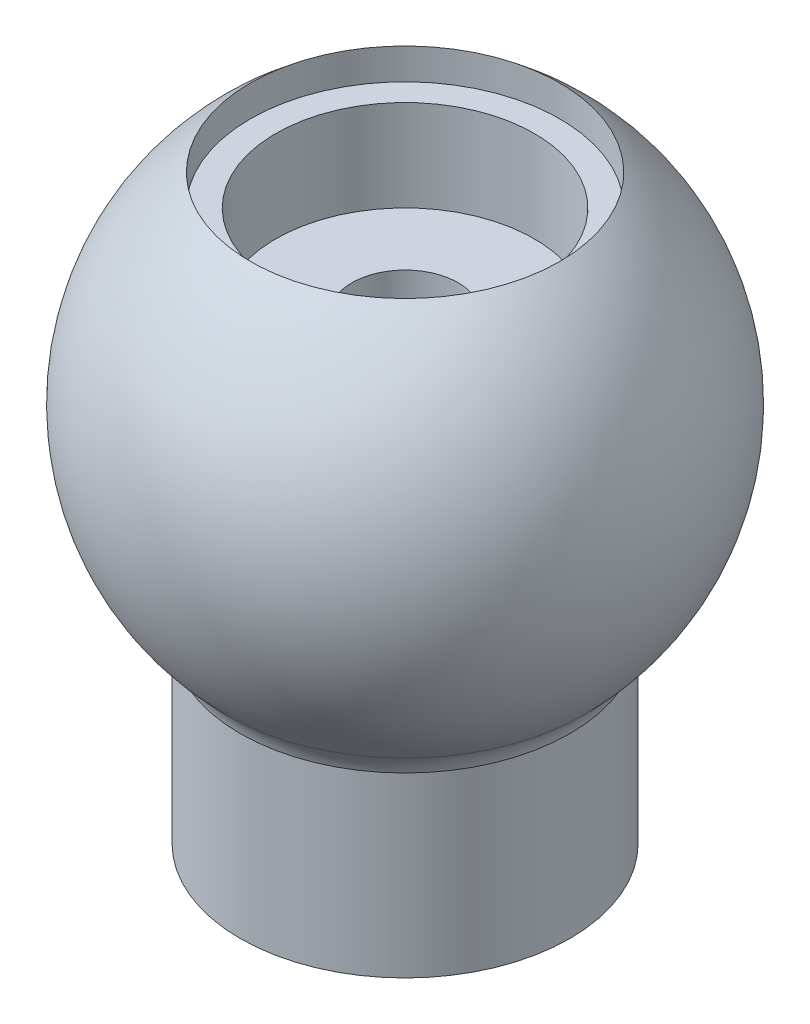
ISO-10303-21;
HEADER;
FILE_DESCRIPTION(('STEP AP214'),'2;1');
FILE_NAME('part.step','',(''),(''),'','','');
FILE_SCHEMA(('AUTOMOTIVE_DESIGN { 1 0 10303 214 1 1 1 1 }'));
ENDSEC;
DATA;
#1=APPLICATION_CONTEXT('core data for automotive mechanical design processes');
#2=APPLICATION_PROTOCOL_DEFINITION('international standard','automotive_design',2000,#1);
#3=PRODUCT_CONTEXT('',#1,'mechanical');
#4=PRODUCT('Part','Part','',(#3));
#5=PRODUCT_RELATED_PRODUCT_CATEGORY('part','',(#4));
#6=PRODUCT_DEFINITION_FORMATION('','',#4);
#7=PRODUCT_DEFINITION_CONTEXT('part definition',#1,'design');
#8=PRODUCT_DEFINITION('design','',#6,#7);
#9=PRODUCT_DEFINITION_SHAPE('','',#8);
#10=(LENGTH_UNIT() NAMED_UNIT(*) SI_UNIT(.MILLI.,.METRE.));
#11=(NAMED_UNIT(*) PLANE_ANGLE_UNIT() SI_UNIT($,.RADIAN.));
#12=(NAMED_UNIT(*) SI_UNIT($,.STERADIAN.) SOLID_ANGLE_UNIT());
#13=UNCERTAINTY_MEASURE_WITH_UNIT(LENGTH_MEASURE(1.E-05),#10,'distance_accuracy_value','');
#14=(GEOMETRIC_REPRESENTATION_CONTEXT(3) GLOBAL_UNCERTAINTY_ASSIGNED_CONTEXT((#13)) GLOBAL_UNIT_ASSIGNED_CONTEXT((#10,
#11,#12)) REPRESENTATION_CONTEXT('',''));
#15=CARTESIAN_POINT('',(0.,0.,0.));
#16=DIRECTION('',(0.,0.,1.));
#17=DIRECTION('',(1.,0.,0.));
#18=AXIS2_PLACEMENT_3D('',#15,#16,#17);
#19=CARTESIAN_POINT('',(0.,3.5,0.));
#20=DIRECTION('',(0.,-1.,0.));
#21=DIRECTION('',(0.,0.,-1.));
#22=AXIS2_PLACEMENT_3D('',#19,#20,#21);
#23=CYLINDRICAL_SURFACE('',#22,3.25);
#24=CARTESIAN_POINT('',(0.,3.5,0.));
#25=DIRECTION('',(0.,1.,0.));
#26=DIRECTION('',(0.,0.,1.));
#27=AXIS2_PLACEMENT_3D('',#24,#25,#26);
#28=CIRCLE('',#27,3.25);
#29=CARTESIAN_POINT('',(0.,3.5,3.25));
#30=VERTEX_POINT('',#29);
#31=EDGE_CURVE('E37',#30,#30,#28,.T.);
#32=ORIENTED_EDGE('',*,*,#31,.F.);
#33=EDGE_LOOP('',(#32));
#34=FACE_BOUND('',#33,.T.);
#35=CARTESIAN_POINT('',(0.,0.,0.));
#36=DIRECTION('',(0.,1.,0.));
#37=DIRECTION('',(0.,0.,1.));
#38=AXIS2_PLACEMENT_3D('',#35,#36,#37);
#39=CIRCLE('',#38,3.25);
#40=CARTESIAN_POINT('',(0.,0.,3.25));
#41=VERTEX_POINT('',#40);
#42=EDGE_CURVE('E41',#41,#41,#39,.T.);
#43=ORIENTED_EDGE('',*,*,#42,.T.);
#44=EDGE_LOOP('',(#43));
#45=FACE_BOUND('',#44,.T.);
#46=ADVANCED_FACE('F30',(#34,#45),#23,.T.);
#47=CARTESIAN_POINT('',(0.,0.,0.));
#48=DIRECTION('',(0.,1.,0.));
#49=DIRECTION('',(0.,0.,1.));
#50=AXIS2_PLACEMENT_3D('',#47,#48,#49);
#51=PLANE('',#50);
#52=CARTESIAN_POINT('',(0.,0.,0.));
#53=DIRECTION('',(0.,1.,0.));
#54=DIRECTION('',(0.,0.,1.));
#55=AXIS2_PLACEMENT_3D('',#52,#53,#54);
#56=CIRCLE('',#55,1.05);
#57=CARTESIAN_POINT('',(0.,0.,1.05));
#58=VERTEX_POINT('',#57);
#59=EDGE_CURVE('E64',#58,#58,#56,.T.);
#60=ORIENTED_EDGE('',*,*,#59,.T.);
#61=EDGE_LOOP('',(#60));
#62=FACE_BOUND('',#61,.T.);
#63=ORIENTED_EDGE('',*,*,#42,.F.);
#64=EDGE_LOOP('',(#63));
#65=FACE_BOUND('',#64,.T.);
#66=ADVANCED_FACE('F72',(#62,#65),#51,.F.);
#67=CARTESIAN_POINT('',(0.,7.5,0.));
#68=DIRECTION('',(0.,-1.,0.));
#69=DIRECTION('',(-1.,0.,0.));
#70=AXIS2_PLACEMENT_3D('',#67,#68,#69);
#71=SPHERICAL_SURFACE('',#70,5.);
#72=CARTESIAN_POINT('',(0.,3.93911132252384,0.));
#73=DIRECTION('',(0.,1.,0.));
#74=DIRECTION('',(0.,0.,1.));
#75=AXIS2_PLACEMENT_3D('',#72,#73,#74);
#76=CIRCLE('',#75,3.50999598669601);
#77=CARTESIAN_POINT('',(-3.50999598669601,3.93911132252384,0.));
#78=VERTEX_POINT('',#77);
#79=EDGE_CURVE('E10',#78,#78,#76,.T.);
#80=CARTESIAN_POINT('',(0.,11.4620070671315,0.));
#81=DIRECTION('',(0.,-1.,0.));
#82=DIRECTION('',(0.,0.,-1.));
#83=AXIS2_PLACEMENT_3D('',#80,#81,#82);
#84=CIRCLE('',#83,3.05);
#85=CARTESIAN_POINT('',(-3.05,11.4620070671315,0.));
#86=VERTEX_POINT('',#85);
#87=EDGE_CURVE('E46',#86,#86,#84,.F.);
#88=CARTESIAN_POINT('',(-3.50999598669601,3.93911132252384,0.));
#89=CARTESIAN_POINT('',(-3.573327115563,4.00153391422884,0.));
#90=CARTESIAN_POINT('',(-3.63498945103462,4.06564917667449,0.));
#91=CARTESIAN_POINT('',(-3.75480891274869,4.19707539904415,0.));
#92=CARTESIAN_POINT('',(-3.81296603899115,4.26438635896814,0.));
#93=CARTESIAN_POINT('',(-3.92560745980848,4.40201433229151,0.));
#94=CARTESIAN_POINT('',(-3.98009175438335,4.47233134569088,0.));
#95=CARTESIAN_POINT('',(-4.08523301525127,4.61577078980586,0.));
#96=CARTESIAN_POINT('',(-4.13588998154432,4.68889322052148,0.));
#97=CARTESIAN_POINT('',(-4.23323226552499,4.83773553191915,0.));
#98=CARTESIAN_POINT('',(-4.27991758321261,4.91345541260121,0.));
#99=CARTESIAN_POINT('',(-4.36918374482401,5.06727708931152,0.));
#100=CARTESIAN_POINT('',(-4.4117645887478,5.14537888533977,0.));
#101=CARTESIAN_POINT('',(-4.49270060752105,5.30374212610902,0.));
#102=CARTESIAN_POINT('',(-4.53105578237051,5.38400357085003,0.));
#103=CARTESIAN_POINT('',(-4.60343130765421,5.54645768352147,0.));
#104=CARTESIAN_POINT('',(-4.63745165808845,5.6286503514519,0.));
#105=CARTESIAN_POINT('',(-4.70106071235408,5.79473299211258,0.));
#106=CARTESIAN_POINT('',(-4.73064941618547,5.87862296484283,0.));
#107=CARTESIAN_POINT('',(-4.7853109684469,6.04786146530764,0.));
#108=CARTESIAN_POINT('',(-4.81038381687692,6.13320999304219,0.));
#109=CARTESIAN_POINT('',(-4.85594230132879,6.30512270293604,0.));
#110=CARTESIAN_POINT('',(-4.87642793735062,6.39168688509534,0.));
#111=CARTESIAN_POINT('',(-4.91275369518806,6.56578454346013,0.));
#112=CARTESIAN_POINT('',(-4.92859381700367,6.65331801966562,0.));
#113=CARTESIAN_POINT('',(-4.95558346567537,6.82910514716523,0.));
#114=CARTESIAN_POINT('',(-4.96673299253146,6.91735879845936,0.));
#115=CARTESIAN_POINT('',(-4.98430971989892,7.09433510756656,0.));
#116=CARTESIAN_POINT('',(-4.99073692041027,7.18305776537963,0.));
#117=CARTESIAN_POINT('',(-4.99885070337164,7.36071958417074,0.));
#118=CARTESIAN_POINT('',(-5.00053728582165,7.44965874514878,0.));
#119=CARTESIAN_POINT('',(-4.99916503267204,7.62750045075074,0.));
#120=CARTESIAN_POINT('',(-4.99610619707242,7.71640299537467,0.));
#121=CARTESIAN_POINT('',(-4.98525181322377,7.89391845295902,0.));
#122=CARTESIAN_POINT('',(-4.97745626497475,7.98253136591945,0.));
#123=CARTESIAN_POINT('',(-4.9571506418408,8.15921536915479,0.));
#124=CARTESIAN_POINT('',(-4.94464056695588,8.2472864594297,0.));
#125=CARTESIAN_POINT('',(-4.91494149403565,8.42263616829112,0.));
#126=CARTESIAN_POINT('',(-4.89775249600036,8.50991478687764,0.));
#127=CARTESIAN_POINT('',(-4.8587444964104,8.68343115872234,0.));
#128=CARTESIAN_POINT('',(-4.83692549485574,8.76966891198052,0.));
#129=CARTESIAN_POINT('',(-4.78871958477749,8.9408581218143,0.));
#130=CARTESIAN_POINT('',(-4.7623326762539,9.02580957838991,0.));
#131=CARTESIAN_POINT('',(-4.70506604898745,9.19418442429063,0.));
#132=CARTESIAN_POINT('',(-4.67418633024459,9.27760781361575,0.));
#133=CARTESIAN_POINT('',(-4.60802196574307,9.44268910328453,0.));
#134=CARTESIAN_POINT('',(-4.57273731998441,9.5243470036282,0.));
#135=CARTESIAN_POINT('',(-4.49786352107357,9.68566491823121,0.));
#136=CARTESIAN_POINT('',(-4.4582743679214,9.76532493249055,0.));
#137=CARTESIAN_POINT('',(-4.37490422417574,9.92242036350375,0.));
#138=CARTESIAN_POINT('',(-4.33112323358225,9.9998557802576,0.));
#139=CARTESIAN_POINT('',(-4.23949401568466,10.1522816370255,0.));
#140=CARTESIAN_POINT('',(-4.19164578838055,10.2272720770396,0.));
#141=CARTESIAN_POINT('',(-4.09201826983277,10.37459455567,0.));
#142=CARTESIAN_POINT('',(-4.0402389785891,10.4469265942864,0.));
#143=CARTESIAN_POINT('',(-3.9328967048278,10.5887264253813,0.));
#144=CARTESIAN_POINT('',(-3.87733372231019,10.6581942178599,0.));
#145=CARTESIAN_POINT('',(-3.76258216166749,10.7940678107426,0.));
#146=CARTESIAN_POINT('',(-3.70339358354241,10.8604736111467,0.));
#147=CARTESIAN_POINT('',(-3.5815594149077,10.9900343853725,0.));
#148=CARTESIAN_POINT('',(-3.51891382439807,11.0531893591943,0.));
#149=CARTESIAN_POINT('',(-3.39034342148767,11.1760681621682,0.));
#150=CARTESIAN_POINT('',(-3.3244186090869,11.2357919913203,0.));
#151=CARTESIAN_POINT('',(-3.18947924167802,11.3516406963416,0.));
#152=CARTESIAN_POINT('',(-3.1204646866699,11.4077655722107,0.));
#153=CARTESIAN_POINT('',(-3.05,11.4620070671315,0.));
#154=B_SPLINE_CURVE_WITH_KNOTS('',3,(#88,#89,#90,#91,#92,#93,#94,#95,#96,#97,#98,#99,#100,#101,
#102,#103,#104,#105,#106,#107,#108,#109,#110,#111,#112,#113,#114,#115,#116,#117,#118,#119,#120,
#121,#122,#123,#124,#125,#126,#127,#128,#129,#130,#131,#132,#133,#134,#135,#136,#137,#138,#139,
#140,#141,#142,#143,#144,#145,#146,#147,#148,#149,#150,#151,#152,#153),.UNSPECIFIED.,.F.,.F.,(4,
2,2,2,2,2,2,2,2,2,2,2,2,2,2,2,2,2,2,2,2,2,2,2,2,2,2,2,2,2,2,2,4),(0.,0.266738870931822,
0.533477741863643,0.800216612795464,1.06695548372729,1.33369435465911,1.60043322559093,
1.86717209652275,2.13391096745457,2.40064983838639,2.66738870931821,2.93412758025003,
3.20086645118185,3.46760532211367,3.7343441930455,4.00108306397732,4.26782193490914,
4.53456080584096,4.80129967677278,5.0680385477046,5.33477741863642,5.60151628956824,
5.86825516050007,6.13499403143189,6.40173290236371,6.66847177329553,6.93521064422735,
7.20194951515917,7.46868838609099,7.73542725702281,8.00216612795463,8.26890499888645,
8.53564386981827),.UNSPECIFIED.);
#155=EDGE_CURVE('BSEAM96',#78,#86,#154,.T.);
#156=ORIENTED_EDGE('',*,*,#79,.T.);
#157=ORIENTED_EDGE('',*,*,#87,.F.);
#158=ORIENTED_EDGE('',*,*,#155,.T.);
#159=ORIENTED_EDGE('',*,*,#155,.F.);
#160=EDGE_LOOP('',(#156,#158,#157,#159));
#161=FACE_BOUND('',#160,.T.);
#162=ADVANCED_FACE('F96',(#161),#71,.T.);
#163=CARTESIAN_POINT('',(0.,10.85,0.));
#164=DIRECTION('',(0.,-1.,0.));
#165=DIRECTION('',(0.,0.,-1.));
#166=AXIS2_PLACEMENT_3D('',#163,#164,#165);
#167=PLANE('',#166);
#168=CARTESIAN_POINT('',(0.,10.85,0.));
#169=DIRECTION('',(0.,1.,0.));
#170=DIRECTION('',(0.,0.,1.));
#171=AXIS2_PLACEMENT_3D('',#168,#169,#170);
#172=CIRCLE('',#171,2.55);
#173=CARTESIAN_POINT('',(0.,10.85,2.55));
#174=VERTEX_POINT('',#173);
#175=EDGE_CURVE('E59',#174,#174,#172,.T.);
#176=ORIENTED_EDGE('',*,*,#175,.F.);
#177=EDGE_LOOP('',(#176));
#178=FACE_BOUND('',#177,.T.);
#179=CARTESIAN_POINT('',(0.,10.85,0.));
#180=DIRECTION('',(0.,-1.,0.));
#181=DIRECTION('',(1.,0.,0.));
#182=AXIS2_PLACEMENT_3D('',#179,#180,#181);
#183=CIRCLE('',#182,3.05);
#184=CARTESIAN_POINT('',(3.05,10.85,0.));
#185=VERTEX_POINT('',#184);
#186=EDGE_CURVE('E49',#185,#185,#183,.T.);
#187=ORIENTED_EDGE('',*,*,#186,.F.);
#188=EDGE_LOOP('',(#187));
#189=FACE_BOUND('',#188,.T.);
#190=ADVANCED_FACE('F102',(#178,#189),#167,.F.);
#191=CARTESIAN_POINT('',(0.,3.5,0.));
#192=DIRECTION('',(0.,-1.,0.));
#193=DIRECTION('',(0.,0.,-1.));
#194=AXIS2_PLACEMENT_3D('',#191,#192,#193);
#195=CYLINDRICAL_SURFACE('',#194,3.05);
#196=ORIENTED_EDGE('',*,*,#87,.T.);
#197=EDGE_LOOP('',(#196));
#198=FACE_BOUND('',#197,.T.);
#199=ORIENTED_EDGE('',*,*,#186,.T.);
#200=EDGE_LOOP('',(#199));
#201=FACE_BOUND('',#200,.T.);
#202=ADVANCED_FACE('F88',(#198,#201),#195,.F.);
#203=CARTESIAN_POINT('',(0.,9.05,0.));
#204=DIRECTION('',(0.,1.,0.));
#205=DIRECTION('',(0.,0.,1.));
#206=AXIS2_PLACEMENT_3D('',#203,#204,#205);
#207=CYLINDRICAL_SURFACE('',#206,2.55);
#208=CARTESIAN_POINT('',(0.,9.05,0.));
#209=DIRECTION('',(0.,1.,0.));
#210=DIRECTION('',(0.,0.,1.));
#211=AXIS2_PLACEMENT_3D('',#208,#209,#210);
#212=CIRCLE('',#211,2.55);
#213=CARTESIAN_POINT('',(0.,9.05,2.55));
#214=VERTEX_POINT('',#213);
#215=EDGE_CURVE('E55',#214,#214,#212,.T.);
#216=ORIENTED_EDGE('',*,*,#215,.F.);
#217=EDGE_LOOP('',(#216));
#218=FACE_BOUND('',#217,.T.);
#219=ORIENTED_EDGE('',*,*,#175,.T.);
#220=EDGE_LOOP('',(#219));
#221=FACE_BOUND('',#220,.T.);
#222=ADVANCED_FACE('F83',(#218,#221),#207,.F.);
#223=CARTESIAN_POINT('',(0.,9.05,0.));
#224=DIRECTION('',(0.,1.,0.));
#225=DIRECTION('',(0.,0.,1.));
#226=AXIS2_PLACEMENT_3D('',#223,#224,#225);
#227=PLANE('',#226);
#228=CARTESIAN_POINT('',(0.,9.05,0.));
#229=DIRECTION('',(0.,1.,0.));
#230=DIRECTION('',(0.,0.,1.));
#231=AXIS2_PLACEMENT_3D('',#228,#229,#230);
#232=CIRCLE('',#231,1.05);
#233=CARTESIAN_POINT('',(0.,9.05,1.05));
#234=VERTEX_POINT('',#233);
#235=EDGE_CURVE('E66',#234,#234,#232,.T.);
#236=ORIENTED_EDGE('',*,*,#235,.F.);
#237=EDGE_LOOP('',(#236));
#238=FACE_BOUND('',#237,.T.);
#239=ORIENTED_EDGE('',*,*,#215,.T.);
#240=EDGE_LOOP('',(#239));
#241=FACE_BOUND('',#240,.T.);
#242=ADVANCED_FACE('F78',(#238,#241),#227,.T.);
#243=CARTESIAN_POINT('',(0.,0.,0.));
#244=DIRECTION('',(0.,1.,0.));
#245=DIRECTION('',(0.,0.,1.));
#246=AXIS2_PLACEMENT_3D('',#243,#244,#245);
#247=CYLINDRICAL_SURFACE('',#246,1.05);
#248=CARTESIAN_POINT('',(0.,0.,1.05));
#249=CARTESIAN_POINT('',(0.,0.0942708333333333,1.05));
#250=CARTESIAN_POINT('',(0.,0.188541666666667,1.05));
#251=CARTESIAN_POINT('',(0.,0.377083333333333,1.05));
#252=CARTESIAN_POINT('',(0.,0.471354166666667,1.05));
#253=CARTESIAN_POINT('',(0.,0.659895833333333,1.05));
#254=CARTESIAN_POINT('',(0.,0.754166666666667,1.05));
#255=CARTESIAN_POINT('',(0.,0.942708333333333,1.05));
#256=CARTESIAN_POINT('',(0.,1.03697916666667,1.05));
#257=CARTESIAN_POINT('',(0.,1.22552083333333,1.05));
#258=CARTESIAN_POINT('',(0.,1.31979166666667,1.05));
#259=CARTESIAN_POINT('',(0.,1.50833333333333,1.05));
#260=CARTESIAN_POINT('',(0.,1.60260416666667,1.05));
#261=CARTESIAN_POINT('',(0.,1.79114583333333,1.05));
#262=CARTESIAN_POINT('',(0.,1.88541666666667,1.05));
#263=CARTESIAN_POINT('',(0.,2.07395833333333,1.05));
#264=CARTESIAN_POINT('',(0.,2.16822916666667,1.05));
#265=CARTESIAN_POINT('',(0.,2.35677083333333,1.05));
#266=CARTESIAN_POINT('',(0.,2.45104166666667,1.05));
#267=CARTESIAN_POINT('',(0.,2.63958333333333,1.05));
#268=CARTESIAN_POINT('',(0.,2.73385416666667,1.05));
#269=CARTESIAN_POINT('',(0.,2.92239583333333,1.05));
#270=CARTESIAN_POINT('',(0.,3.01666666666667,1.05));
#271=CARTESIAN_POINT('',(0.,3.20520833333333,1.05));
#272=CARTESIAN_POINT('',(0.,3.29947916666667,1.05));
#273=CARTESIAN_POINT('',(0.,3.48802083333333,1.05));
#274=CARTESIAN_POINT('',(0.,3.58229166666667,1.05));
#275=CARTESIAN_POINT('',(0.,3.77083333333333,1.05));
#276=CARTESIAN_POINT('',(0.,3.86510416666667,1.05));
#277=CARTESIAN_POINT('',(0.,4.05364583333333,1.05));
#278=CARTESIAN_POINT('',(0.,4.14791666666667,1.05));
#279=CARTESIAN_POINT('',(0.,4.33645833333333,1.05));
#280=CARTESIAN_POINT('',(0.,4.43072916666667,1.05));
#281=CARTESIAN_POINT('',(0.,4.61927083333333,1.05));
#282=CARTESIAN_POINT('',(0.,4.71354166666667,1.05));
#283=CARTESIAN_POINT('',(0.,4.90208333333333,1.05));
#284=CARTESIAN_POINT('',(0.,4.99635416666667,1.05));
#285=CARTESIAN_POINT('',(0.,5.18489583333333,1.05));
#286=CARTESIAN_POINT('',(0.,5.27916666666667,1.05));
#287=CARTESIAN_POINT('',(0.,5.46770833333333,1.05));
#288=CARTESIAN_POINT('',(0.,5.56197916666667,1.05));
#289=CARTESIAN_POINT('',(0.,5.75052083333333,1.05));
#290=CARTESIAN_POINT('',(0.,5.84479166666667,1.05));
#291=CARTESIAN_POINT('',(0.,6.03333333333333,1.05));
#292=CARTESIAN_POINT('',(0.,6.12760416666667,1.05));
#293=CARTESIAN_POINT('',(0.,6.31614583333333,1.05));
#294=CARTESIAN_POINT('',(0.,6.41041666666667,1.05));
#295=CARTESIAN_POINT('',(0.,6.59895833333333,1.05));
#296=CARTESIAN_POINT('',(0.,6.69322916666667,1.05));
#297=CARTESIAN_POINT('',(0.,6.88177083333333,1.05));
#298=CARTESIAN_POINT('',(0.,6.97604166666667,1.05));
#299=CARTESIAN_POINT('',(0.,7.16458333333333,1.05));
#300=CARTESIAN_POINT('',(0.,7.25885416666667,1.05));
#301=CARTESIAN_POINT('',(0.,7.44739583333333,1.05));
#302=CARTESIAN_POINT('',(0.,7.54166666666667,1.05));
#303=CARTESIAN_POINT('',(0.,7.73020833333333,1.05));
#304=CARTESIAN_POINT('',(0.,7.82447916666667,1.05));
#305=CARTESIAN_POINT('',(0.,8.01302083333333,1.05));
#306=CARTESIAN_POINT('',(0.,8.10729166666667,1.05));
#307=CARTESIAN_POINT('',(0.,8.29583333333333,1.05));
#308=CARTESIAN_POINT('',(0.,8.39010416666667,1.05));
#309=CARTESIAN_POINT('',(0.,8.57864583333333,1.05));
#310=CARTESIAN_POINT('',(0.,8.67291666666667,1.05));
#311=CARTESIAN_POINT('',(0.,8.86145833333333,1.05));
#312=CARTESIAN_POINT('',(0.,8.95572916666667,1.05));
#313=CARTESIAN_POINT('',(0.,9.05,1.05));
#314=B_SPLINE_CURVE_WITH_KNOTS('',3,(#248,#249,#250,#251,#252,#253,#254,#255,#256,#257,#258,
#259,#260,#261,#262,#263,#264,#265,#266,#267,#268,#269,#270,#271,#272,#273,#274,#275,#276,#277,
#278,#279,#280,#281,#282,#283,#284,#285,#286,#287,#288,#289,#290,#291,#292,#293,#294,#295,#296,
#297,#298,#299,#300,#301,#302,#303,#304,#305,#306,#307,#308,#309,#310,#311,#312,#313),
.UNSPECIFIED.,.F.,.F.,(4,2,2,2,2,2,2,2,2,2,2,2,2,2,2,2,2,2,2,2,2,2,2,2,2,2,2,2,2,2,2,2,4),(0.,
0.2828125,0.565625,0.8484375,1.13125,1.4140625,1.696875,1.9796875,2.2625,2.5453125,2.828125,
3.1109375,3.39375,3.6765625,3.959375,4.2421875,4.525,4.8078125,5.090625,5.3734375,5.65625,
5.9390625,6.221875,6.5046875,6.7875,7.0703125,7.353125,7.6359375,7.91875,8.2015625,8.484375,
8.7671875,9.05),.UNSPECIFIED.);
#315=EDGE_CURVE('BSEAM75',#58,#234,#314,.T.);
#316=ORIENTED_EDGE('',*,*,#59,.F.);
#317=ORIENTED_EDGE('',*,*,#235,.T.);
#318=ORIENTED_EDGE('',*,*,#315,.T.);
#319=ORIENTED_EDGE('',*,*,#315,.F.);
#320=EDGE_LOOP('',(#316,#318,#317,#319));
#321=FACE_BOUND('',#320,.T.);
#322=ADVANCED_FACE('F75',(#321),#247,.F.);
#323=CARTESIAN_POINT('',(0.,3.22693358702861,0.));
#324=DIRECTION('',(0.,1.,0.));
#325=DIRECTION('',(0.,0.,1.));
#326=AXIS2_PLACEMENT_3D('',#323,#324,#325);
#327=TOROIDAL_SURFACE('',#326,4.21199518403521,1.);
#328=ORIENTED_EDGE('',*,*,#31,.T.);
#329=EDGE_LOOP('',(#328));
#330=FACE_BOUND('',#329,.T.);
#331=ORIENTED_EDGE('',*,*,#79,.F.);
#332=EDGE_LOOP('',(#331));
#333=FACE_BOUND('',#332,.T.);
#334=ADVANCED_FACE('F32',(#330,#333),#327,.F.);
#335=CLOSED_SHELL('',(#46,#66,#162,#190,#202,#222,#242,#322,#334));
#336=MANIFOLD_SOLID_BREP('B2',#335);
#337=ADVANCED_BREP_SHAPE_REPRESENTATION('',(#18,#336),#14);
#338=SHAPE_DEFINITION_REPRESENTATION(#9,#337);
ENDSEC;
END-ISO-10303-21;
